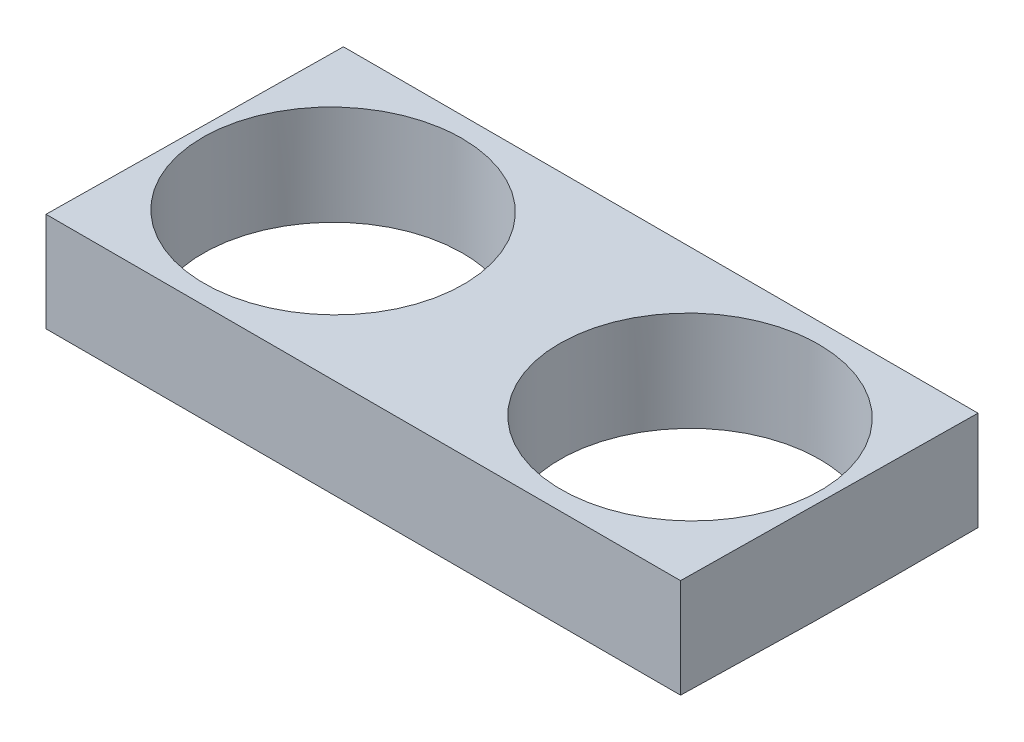
ISO-10303-21;
HEADER;
FILE_DESCRIPTION(('STEP AP214'),'2;1');
FILE_NAME('part.step','',(''),(''),'','','');
FILE_SCHEMA(('AUTOMOTIVE_DESIGN { 1 0 10303 214 1 1 1 1 }'));
ENDSEC;
DATA;
#1=APPLICATION_CONTEXT('core data for automotive mechanical design processes');
#2=APPLICATION_PROTOCOL_DEFINITION('international standard','automotive_design',2000,#1);
#3=PRODUCT_CONTEXT('',#1,'mechanical');
#4=PRODUCT('Part','Part','',(#3));
#5=PRODUCT_RELATED_PRODUCT_CATEGORY('part','',(#4));
#6=PRODUCT_DEFINITION_FORMATION('','',#4);
#7=PRODUCT_DEFINITION_CONTEXT('part definition',#1,'design');
#8=PRODUCT_DEFINITION('design','',#6,#7);
#9=PRODUCT_DEFINITION_SHAPE('','',#8);
#10=(LENGTH_UNIT() NAMED_UNIT(*) SI_UNIT(.MILLI.,.METRE.));
#11=(NAMED_UNIT(*) PLANE_ANGLE_UNIT() SI_UNIT($,.RADIAN.));
#12=(NAMED_UNIT(*) SI_UNIT($,.STERADIAN.) SOLID_ANGLE_UNIT());
#13=UNCERTAINTY_MEASURE_WITH_UNIT(LENGTH_MEASURE(1.E-05),#10,'distance_accuracy_value','');
#14=(GEOMETRIC_REPRESENTATION_CONTEXT(3) GLOBAL_UNCERTAINTY_ASSIGNED_CONTEXT((#13)) GLOBAL_UNIT_ASSIGNED_CONTEXT((#10,
#11,#12)) REPRESENTATION_CONTEXT('',''));
#15=CARTESIAN_POINT('',(0.,0.,0.));
#16=DIRECTION('',(0.,0.,1.));
#17=DIRECTION('',(1.,0.,0.));
#18=AXIS2_PLACEMENT_3D('',#15,#16,#17);
#19=CARTESIAN_POINT('',(-40.,-39.376697628539,0.));
#20=CARTESIAN_POINT('',(-40.,-37.8138326416831,-18.6089310298579));
#21=CARTESIAN_POINT('',(-40.,-41.4487875194083,-60.5220187074735));
#22=CARTESIAN_POINT('',(-40.,-41.8150395607881,-82.6293162514277));
#23=CARTESIAN_POINT('',(-40.,-29.981594576715,-94.4769548986795));
#24=CARTESIAN_POINT('',(-40.,-11.4071796829403,-72.3520517103376));
#25=CARTESIAN_POINT('',(-40.,50.0000000000028,-96.0000000000011));
#26=B_SPLINE_CURVE_WITH_KNOTS('',3,(#19,#20,#21,#22,#23,#24,#25),.UNSPECIFIED.,.F.,.F.,(4,1,1,1,
4),(0.,0.361871867439847,0.526261734758969,0.755385014590914,1.),.UNSPECIFIED.);
#27=DIRECTION('',(1.,0.,0.));
#28=VECTOR('',#27,1.);
#29=SURFACE_OF_LINEAR_EXTRUSION('',#26,#28);
#30=OFFSET_SURFACE('',#29,2.,.F.);
#31=CARTESIAN_POINT('',(-8.2,-43.4846999674052,-71.6589197518851));
#32=CARTESIAN_POINT('',(-8.2730311046294,-43.484700119259,-71.6589147411898));
#33=CARTESIAN_POINT('',(-8.34613827360442,-43.4847299976871,-71.652736707036));
#34=CARTESIAN_POINT('',(-8.45417117350626,-43.4848109393846,-71.6343574716182));
#35=CARTESIAN_POINT('',(-8.48993961729016,-43.4848439827656,-71.6267022929182));
#36=CARTESIAN_POINT('',(-8.5607403010147,-43.4849184029568,-71.6084015263036));
#37=CARTESIAN_POINT('',(-8.59577186269367,-43.484959787103,-71.5977533026889));
#38=CARTESIAN_POINT('',(-8.69924019137452,-43.4850898867195,-71.5614551785135));
#39=CARTESIAN_POINT('',(-8.76619225916654,-43.485184686194,-71.5314275694439));
#40=CARTESIAN_POINT('',(-8.89409773886185,-43.4853431040892,-71.4605441009441));
#41=CARTESIAN_POINT('',(-8.95505103639645,-43.4854067219156,-71.4196880351204));
#42=CARTESIAN_POINT('',(-9.04065984135483,-43.4854371714287,-71.35120631223));
#43=CARTESIAN_POINT('',(-9.06824224043239,-43.4854364697085,-71.3271611680723));
#44=CARTESIAN_POINT('',(-9.12125957292011,-43.4854065274751,-71.2768596953833));
#45=CARTESIAN_POINT('',(-9.14669654461631,-43.4853773143889,-71.2506055140542));
#46=CARTESIAN_POINT('',(-9.21956411274409,-43.485236688028,-71.1687421504002));
#47=CARTESIAN_POINT('',(-9.26357272305283,-43.4850723052621,-71.1100150266277));
#48=CARTESIAN_POINT('',(-9.34107848889395,-43.4845573771236,-70.9860410708964));
#49=CARTESIAN_POINT('',(-9.3745764461837,-43.484206845956,-70.9207947367269));
#50=CARTESIAN_POINT('',(-9.43015052031911,-43.4832915357773,-70.7855982753886));
#51=CARTESIAN_POINT('',(-9.45222666255389,-43.4827267572426,-70.715648158676));
#52=CARTESIAN_POINT('',(-9.48432261408263,-43.4813764152878,-70.573038247623));
#53=CARTESIAN_POINT('',(-9.49434228620548,-43.4805908493559,-70.5003784224629));
#54=CARTESIAN_POINT('',(-9.50204473417239,-43.4788158402181,-70.3544098638106));
#55=CARTESIAN_POINT('',(-9.49972751746942,-43.4778263971354,-70.2811011307104));
#56=CARTESIAN_POINT('',(-9.48282126129271,-43.4756827445833,-70.1359004551674));
#57=CARTESIAN_POINT('',(-9.46822977725025,-43.4745285023302,-70.0640087978716));
#58=CARTESIAN_POINT('',(-9.42718711418465,-43.4721136794608,-69.92369623756));
#59=CARTESIAN_POINT('',(-9.40073590063537,-43.4708530985349,-69.8552753446489));
#60=CARTESIAN_POINT('',(-9.33671590124714,-43.4682971320555,-69.7238274966024));
#61=CARTESIAN_POINT('',(-9.29914420095267,-43.4670017374591,-69.6608019610709));
#62=CARTESIAN_POINT('',(-9.21395143536276,-43.4644555358836,-69.5419534367519));
#63=CARTESIAN_POINT('',(-9.16633036871399,-43.4632047289105,-69.4861304489344));
#64=CARTESIAN_POINT('',(-9.06238783212648,-43.4608270812761,-69.3832707261848));
#65=CARTESIAN_POINT('',(-9.00606613741011,-43.4597002438187,-69.3362342183177));
#66=CARTESIAN_POINT('',(-8.88632101247231,-43.4576437747579,-69.252286322884));
#67=CARTESIAN_POINT('',(-8.82289759350578,-43.4567141428421,-69.2153749192715));
#68=CARTESIAN_POINT('',(-8.69077084176426,-43.4551135318066,-69.1527377427121));
#69=CARTESIAN_POINT('',(-8.62206921437095,-43.4544424695614,-69.1270083746023));
#70=CARTESIAN_POINT('',(-8.48131897712118,-43.4534030407574,-69.0874506505962));
#71=CARTESIAN_POINT('',(-8.40927037632351,-43.4530346733793,-69.0736222624912));
#72=CARTESIAN_POINT('',(-8.26390391551165,-43.4526252163381,-69.0582637352704));
#73=CARTESIAN_POINT('',(-8.19058660238719,-43.4525839890151,-69.0567284232448));
#74=CARTESIAN_POINT('',(-8.04473513685116,-43.4528311917071,-69.0659861530408));
#75=CARTESIAN_POINT('',(-7.97220098348782,-43.4531196213215,-69.076779179878));
#76=CARTESIAN_POINT('',(-7.829985634709,-43.454006895811,-69.1103837082416));
#77=CARTESIAN_POINT('',(-7.76030402362397,-43.4546056952842,-69.1331934519377));
#78=CARTESIAN_POINT('',(-7.62575908076851,-43.4560740026886,-69.1901814132578));
#79=CARTESIAN_POINT('',(-7.56089575447095,-43.4569435109272,-69.2243596437947));
#80=CARTESIAN_POINT('',(-7.43780985096077,-43.4588962306794,-69.3031236352898));
#81=CARTESIAN_POINT('',(-7.37958901038297,-43.4599794978777,-69.3477121086986));
#82=CARTESIAN_POINT('',(-7.27145730677073,-43.4622890291189,-69.4460256025569));
#83=CARTESIAN_POINT('',(-7.22154646868581,-43.4635152935911,-69.4997506504365));
#84=CARTESIAN_POINT('',(-7.13142901943667,-43.4660330629112,-69.6148382559401));
#85=CARTESIAN_POINT('',(-7.09122661164371,-43.4673245957262,-69.6762041043677));
#86=CARTESIAN_POINT('',(-7.02169366169863,-43.4698926538338,-69.8048139215318));
#87=CARTESIAN_POINT('',(-6.99236312495257,-43.471169179119,-69.8720578931911));
#88=CARTESIAN_POINT('',(-6.94540090688115,-43.4736331857149,-70.0105327164171));
#89=CARTESIAN_POINT('',(-6.9277718765237,-43.4748206467941,-70.0817644674516));
#90=CARTESIAN_POINT('',(-6.90472427739872,-43.4770438888363,-70.2261786268778));
#91=CARTESIAN_POINT('',(-6.89930572291848,-43.4780796696218,-70.2993610375517));
#92=CARTESIAN_POINT('',(-6.90083647466178,-43.4799548796775,-70.4455920549888));
#93=CARTESIAN_POINT('',(-6.90778421017439,-43.4807943338689,-70.5186406775654));
#94=CARTESIAN_POINT('',(-6.93384156757779,-43.4822542947002,-70.662528069064));
#95=CARTESIAN_POINT('',(-6.95295119452637,-43.482874801249,-70.733366837067));
#96=CARTESIAN_POINT('',(-7.00281210840516,-43.4838975386581,-70.8708440558217));
#97=CARTESIAN_POINT('',(-7.03356043688302,-43.4842998249249,-70.9374835689689));
#98=CARTESIAN_POINT('',(-7.08768986104761,-43.4847568796646,-71.0327875275548));
#99=CARTESIAN_POINT('',(-7.10707180401445,-43.4848848455595,-71.0637849151751));
#100=CARTESIAN_POINT('',(-7.14839374782826,-43.4850972177014,-71.1240700075654));
#101=CARTESIAN_POINT('',(-7.17033619126003,-43.4851815819313,-71.1533560391658));
#102=CARTESIAN_POINT('',(-7.23971960843986,-43.4853769123369,-71.2382309366724));
#103=CARTESIAN_POINT('',(-7.29077087730314,-43.4854305360042,-71.2909318249384));
#104=CARTESIAN_POINT('',(-7.40100404373378,-43.4854368439021,-71.387001365097));
#105=CARTESIAN_POINT('',(-7.46018578578999,-43.485389530063,-71.4303701954426));
#106=CARTESIAN_POINT('',(-7.5537610328151,-43.4852850140953,-71.4875116282677));
#107=CARTESIAN_POINT('',(-7.58578708116999,-43.4852445282061,-71.5052536770715));
#108=CARTESIAN_POINT('',(-7.65118713992218,-43.4851588232747,-71.5379630097838));
#109=CARTESIAN_POINT('',(-7.68455993580243,-43.4851136084409,-71.5529327286016));
#110=CARTESIAN_POINT('',(-7.7863493567919,-43.4849801675932,-71.5935097908752));
#111=CARTESIAN_POINT('',(-7.856541153469,-43.4848939894148,-71.6148485034743));
#112=CARTESIAN_POINT('',(-7.9726366687567,-43.484788052826,-71.6397019245009));
#113=CARTESIAN_POINT('',(-8.0177997616823,-43.484755507254,-71.6468984460223));
#114=CARTESIAN_POINT('',(-8.1086319751997,-43.4847114170324,-71.6565089275008));
#115=CARTESIAN_POINT('',(-8.15430109580753,-43.4846998723834,-71.6589228873065));
#116=CARTESIAN_POINT('',(-8.2,-43.4846999674052,-71.6589197518851));
#117=B_SPLINE_CURVE_WITH_KNOTS('',3,(#31,#32,#33,#34,#35,#36,#37,#38,#39,#40,#41,#42,#43,#44,
#45,#46,#47,#48,#49,#50,#51,#52,#53,#54,#55,#56,#57,#58,#59,#60,#61,#62,#63,#64,#65,#66,#67,#68,
#69,#70,#71,#72,#73,#74,#75,#76,#77,#78,#79,#80,#81,#82,#83,#84,#85,#86,#87,#88,#89,#90,#91,#92,
#93,#94,#95,#96,#97,#98,#99,#100,#101,#102,#103,#104,#105,#106,#107,#108,#109,#110,#111,#112,
#113,#114,#115,#116),.UNSPECIFIED.,.T.,.F.,(4,2,2,2,2,2,2,2,2,2,2,2,2,2,2,2,2,2,2,2,2,2,2,2,2,2,
2,2,2,2,2,2,2,2,2,2,2,2,2,2,2,2,4),(0.,0.218897761283568,0.328527371616642,0.438253826783454,
0.657281143813454,0.876312635867929,0.985973610236148,1.0955291980808,1.31455928998085,
1.53357267010231,1.75258556338514,1.97160094843849,2.19061620117997,2.40967508378666,
2.62873460412351,2.84785158645934,3.06696859830294,3.28609127190325,3.50521359824021,
3.7242654218192,3.9433166525554,4.16227570198346,4.38123448528035,4.60016124771919,
4.81908825882319,5.03807237644529,5.25705715152187,5.47613656914926,5.69521609571452,
5.91434523766549,6.13347463601606,6.35257620351538,6.57167786213309,6.79072386445707,
6.90028728184227,7.00995608489244,7.2289692103031,7.44797814724405,7.55769859620312,
7.66732221698715,7.88620809815425,8.02318244018313,8.16015678654703),.UNSPECIFIED.);
#118=CARTESIAN_POINT('',(-8.2,-43.4846999674052,-71.6589197518851));
#119=VERTEX_POINT('',#118);
#120=EDGE_CURVE('E166',#119,#119,#117,.T.);
#121=ORIENTED_EDGE('',*,*,#120,.T.);
#122=EDGE_LOOP('',(#121));
#123=FACE_BOUND('',#122,.T.);
#124=DIRECTION('',(1.,0.,0.));
#125=VECTOR('',#124,1.);
#126=CARTESIAN_POINT('',(0.,-43.4834502732561,-71.8589316958776));
#127=LINE('',#126,#125);
#128=CARTESIAN_POINT('',(-6.8,-43.4834502732561,-71.8589316958776));
#129=VERTEX_POINT('',#128);
#130=CARTESIAN_POINT('',(-13.2,-43.4834502732561,-71.8589316958776));
#131=VERTEX_POINT('',#130);
#132=EDGE_CURVE('E12',#129,#131,#127,.F.);
#133=ORIENTED_EDGE('',*,*,#132,.F.);
#134=CARTESIAN_POINT('',(-6.8,-43.4471154849081,-68.8589316958776));
#135=CARTESIAN_POINT('',(-6.8,-43.4518691412671,-69.0255607476172));
#136=CARTESIAN_POINT('',(-6.8,-43.4562562444957,-69.1922007044846));
#137=CARTESIAN_POINT('',(-6.8,-43.4642114739682,-69.5254888623006));
#138=CARTESIAN_POINT('',(-6.8,-43.4677796553685,-69.6921370619374));
#139=CARTESIAN_POINT('',(-6.8,-43.4740117074276,-70.0254438197788));
#140=CARTESIAN_POINT('',(-6.8,-43.4766756148282,-70.1921023772872));
#141=CARTESIAN_POINT('',(-6.8,-43.4810050897368,-70.5254341787751));
#142=CARTESIAN_POINT('',(-6.8,-43.4826706478442,-70.6921074228781));
#143=CARTESIAN_POINT('',(-6.8,-43.4849030154317,-71.0254668183174));
#144=CARTESIAN_POINT('',(-6.8,-43.4854697905965,-71.1921529698944));
#145=CARTESIAN_POINT('',(-6.8,-43.4853944042354,-71.5255380658306));
#146=CARTESIAN_POINT('',(-6.8,-43.4847521469752,-71.6922370101577));
#147=CARTESIAN_POINT('',(-6.8,-43.4834502732561,-71.8589316958777));
#148=B_SPLINE_CURVE_WITH_KNOTS('',3,(#134,#135,#136,#137,#138,#139,#140,#141,#142,#143,#144,
#145,#146,#147),.UNSPECIFIED.,.F.,.F.,(4,2,2,2,2,2,4),(0.,0.500090794916213,1.00014789763484,
1.50018467996219,2.00022617069861,2.50028327768226,3.00037998218205),.UNSPECIFIED.);
#149=CARTESIAN_POINT('',(-6.8,-43.4471154849081,-68.8589316958776));
#150=VERTEX_POINT('',#149);
#151=EDGE_CURVE('E123',#150,#129,#148,.T.);
#152=ORIENTED_EDGE('',*,*,#151,.F.);
#153=DIRECTION('',(1.,0.,0.));
#154=VECTOR('',#153,1.);
#155=CARTESIAN_POINT('',(0.,-43.4471154849081,-68.8589316958777));
#156=LINE('',#155,#154);
#157=CARTESIAN_POINT('',(-13.2,-43.4471154849081,-68.8589316958776));
#158=VERTEX_POINT('',#157);
#159=EDGE_CURVE('E163',#150,#158,#156,.F.);
#160=ORIENTED_EDGE('',*,*,#159,.T.);
#161=CARTESIAN_POINT('',(-13.2,-43.4471154849081,-68.8589316958776));
#162=CARTESIAN_POINT('',(-13.2,-43.4518691412671,-69.0255607476172));
#163=CARTESIAN_POINT('',(-13.2,-43.4562562444957,-69.1922007044846));
#164=CARTESIAN_POINT('',(-13.2,-43.4642114739682,-69.5254888623006));
#165=CARTESIAN_POINT('',(-13.2,-43.4677796553685,-69.6921370619374));
#166=CARTESIAN_POINT('',(-13.2,-43.4740117074276,-70.0254438197788));
#167=CARTESIAN_POINT('',(-13.2,-43.4766756148282,-70.1921023772872));
#168=CARTESIAN_POINT('',(-13.2,-43.4810050897368,-70.5254341787751));
#169=CARTESIAN_POINT('',(-13.2,-43.4826706478442,-70.6921074228781));
#170=CARTESIAN_POINT('',(-13.2,-43.4849030154317,-71.0254668183174));
#171=CARTESIAN_POINT('',(-13.2,-43.4854697905965,-71.1921529698944));
#172=CARTESIAN_POINT('',(-13.2,-43.4853944042354,-71.5255380658306));
#173=CARTESIAN_POINT('',(-13.2,-43.4847521469752,-71.6922370101577));
#174=CARTESIAN_POINT('',(-13.2,-43.4834502732561,-71.8589316958777));
#175=B_SPLINE_CURVE_WITH_KNOTS('',3,(#161,#162,#163,#164,#165,#166,#167,#168,#169,#170,#171,
#172,#173,#174),.UNSPECIFIED.,.F.,.F.,(4,2,2,2,2,2,4),(0.,0.500090794916213,1.00014789763484,
1.50018467996219,2.00022617069861,2.50028327768226,3.00037998218205),.UNSPECIFIED.);
#176=EDGE_CURVE('E72',#158,#131,#175,.T.);
#177=ORIENTED_EDGE('',*,*,#176,.T.);
#178=EDGE_LOOP('',(#133,#152,#160,#177));
#179=FACE_BOUND('',#178,.T.);
#180=CARTESIAN_POINT('',(-11.8,-43.4846999674052,-71.6589197518851));
#181=CARTESIAN_POINT('',(-11.8730311046294,-43.484700119259,-71.6589147411898));
#182=CARTESIAN_POINT('',(-11.9461382736044,-43.4847299976871,-71.652736707036));
#183=CARTESIAN_POINT('',(-12.0541711735063,-43.4848109393846,-71.6343574716182));
#184=CARTESIAN_POINT('',(-12.0899396172902,-43.4848439827656,-71.6267022929182));
#185=CARTESIAN_POINT('',(-12.1607403010147,-43.4849184029568,-71.6084015263036));
#186=CARTESIAN_POINT('',(-12.1957718626937,-43.484959787103,-71.5977533026889));
#187=CARTESIAN_POINT('',(-12.2992401913745,-43.4850898867196,-71.5614551785135));
#188=CARTESIAN_POINT('',(-12.3661922591665,-43.485184686194,-71.5314275694439));
#189=CARTESIAN_POINT('',(-12.4940977388619,-43.4853431040892,-71.4605441009441));
#190=CARTESIAN_POINT('',(-12.5550510363965,-43.4854067219156,-71.4196880351204));
#191=CARTESIAN_POINT('',(-12.6406598413548,-43.4854371714287,-71.35120631223));
#192=CARTESIAN_POINT('',(-12.6682422404324,-43.4854364697085,-71.3271611680723));
#193=CARTESIAN_POINT('',(-12.7212595729201,-43.4854065274751,-71.2768596953833));
#194=CARTESIAN_POINT('',(-12.7466965446163,-43.4853773143889,-71.2506055140542));
#195=CARTESIAN_POINT('',(-12.8195641127441,-43.4852366880279,-71.1687421504002));
#196=CARTESIAN_POINT('',(-12.8635727230528,-43.4850723052621,-71.1100150266277));
#197=CARTESIAN_POINT('',(-12.941078488894,-43.4845573771236,-70.9860410708964));
#198=CARTESIAN_POINT('',(-12.9745764461837,-43.484206845956,-70.9207947367269));
#199=CARTESIAN_POINT('',(-13.0301505203191,-43.4832915357773,-70.7855982753886));
#200=CARTESIAN_POINT('',(-13.0522266625539,-43.4827267572426,-70.715648158676));
#201=CARTESIAN_POINT('',(-13.0843226140826,-43.4813764152878,-70.573038247623));
#202=CARTESIAN_POINT('',(-13.0943422862055,-43.4805908493559,-70.5003784224629));
#203=CARTESIAN_POINT('',(-13.1020447341724,-43.4788158402181,-70.3544098638106));
#204=CARTESIAN_POINT('',(-13.0997275174694,-43.4778263971354,-70.2811011307104));
#205=CARTESIAN_POINT('',(-13.0828212612927,-43.4756827445833,-70.1359004551674));
#206=CARTESIAN_POINT('',(-13.0682297772503,-43.4745285023302,-70.0640087978716));
#207=CARTESIAN_POINT('',(-13.0271871141847,-43.4721136794608,-69.92369623756));
#208=CARTESIAN_POINT('',(-13.0007359006354,-43.4708530985349,-69.8552753446489));
#209=CARTESIAN_POINT('',(-12.9367159012472,-43.4682971320555,-69.7238274966024));
#210=CARTESIAN_POINT('',(-12.8991442009527,-43.4670017374591,-69.6608019610709));
#211=CARTESIAN_POINT('',(-12.8139514353628,-43.4644555358836,-69.5419534367519));
#212=CARTESIAN_POINT('',(-12.766330368714,-43.4632047289105,-69.4861304489344));
#213=CARTESIAN_POINT('',(-12.6623878321265,-43.4608270812761,-69.3832707261848));
#214=CARTESIAN_POINT('',(-12.6060661374101,-43.4597002438187,-69.3362342183177));
#215=CARTESIAN_POINT('',(-12.4863210124723,-43.4576437747579,-69.252286322884));
#216=CARTESIAN_POINT('',(-12.4228975935058,-43.4567141428421,-69.2153749192715));
#217=CARTESIAN_POINT('',(-12.2907708417643,-43.4551135318066,-69.1527377427121));
#218=CARTESIAN_POINT('',(-12.222069214371,-43.4544424695614,-69.1270083746023));
#219=CARTESIAN_POINT('',(-12.0813189771212,-43.4534030407574,-69.0874506505962));
#220=CARTESIAN_POINT('',(-12.0092703763235,-43.4530346733793,-69.0736222624912));
#221=CARTESIAN_POINT('',(-11.8639039155117,-43.4526252163381,-69.0582637352704));
#222=CARTESIAN_POINT('',(-11.7905866023872,-43.4525839890151,-69.0567284232448));
#223=CARTESIAN_POINT('',(-11.6447351368512,-43.4528311917071,-69.0659861530408));
#224=CARTESIAN_POINT('',(-11.5722009834878,-43.4531196213215,-69.076779179878));
#225=CARTESIAN_POINT('',(-11.429985634709,-43.454006895811,-69.1103837082416));
#226=CARTESIAN_POINT('',(-11.360304023624,-43.4546056952842,-69.1331934519376));
#227=CARTESIAN_POINT('',(-11.2257590807685,-43.4560740026886,-69.1901814132578));
#228=CARTESIAN_POINT('',(-11.160895754471,-43.4569435109272,-69.2243596437947));
#229=CARTESIAN_POINT('',(-11.0378098509608,-43.4588962306794,-69.3031236352898));
#230=CARTESIAN_POINT('',(-10.979589010383,-43.4599794978777,-69.3477121086986));
#231=CARTESIAN_POINT('',(-10.8714573067707,-43.4622890291189,-69.4460256025569));
#232=CARTESIAN_POINT('',(-10.8215464686858,-43.4635152935911,-69.4997506504365));
#233=CARTESIAN_POINT('',(-10.7314290194367,-43.4660330629112,-69.6148382559401));
#234=CARTESIAN_POINT('',(-10.6912266116437,-43.4673245957262,-69.6762041043677));
#235=CARTESIAN_POINT('',(-10.6216936616986,-43.4698926538338,-69.8048139215318));
#236=CARTESIAN_POINT('',(-10.5923631249526,-43.471169179119,-69.8720578931911));
#237=CARTESIAN_POINT('',(-10.5454009068812,-43.4736331857149,-70.0105327164171));
#238=CARTESIAN_POINT('',(-10.5277718765237,-43.4748206467941,-70.0817644674516));
#239=CARTESIAN_POINT('',(-10.5047242773987,-43.4770438888363,-70.2261786268778));
#240=CARTESIAN_POINT('',(-10.4993057229185,-43.4780796696218,-70.2993610375517));
#241=CARTESIAN_POINT('',(-10.5008364746618,-43.4799548796775,-70.4455920549888));
#242=CARTESIAN_POINT('',(-10.5077842101744,-43.4807943338689,-70.5186406775654));
#243=CARTESIAN_POINT('',(-10.5338415675778,-43.4822542947002,-70.662528069064));
#244=CARTESIAN_POINT('',(-10.5529511945264,-43.482874801249,-70.733366837067));
#245=CARTESIAN_POINT('',(-10.6028121084052,-43.4838975386581,-70.8708440558218));
#246=CARTESIAN_POINT('',(-10.633560436883,-43.4842998249249,-70.9374835689689));
#247=CARTESIAN_POINT('',(-10.6876898610476,-43.4847568796646,-71.0327875275548));
#248=CARTESIAN_POINT('',(-10.7070718040145,-43.4848848455595,-71.0637849151751));
#249=CARTESIAN_POINT('',(-10.7483937478283,-43.4850972177014,-71.1240700075654));
#250=CARTESIAN_POINT('',(-10.77033619126,-43.4851815819313,-71.1533560391658));
#251=CARTESIAN_POINT('',(-10.8397196084399,-43.4853769123369,-71.2382309366724));
#252=CARTESIAN_POINT('',(-10.8907708773031,-43.4854305360042,-71.2909318249384));
#253=CARTESIAN_POINT('',(-11.0010040437338,-43.4854368439021,-71.387001365097));
#254=CARTESIAN_POINT('',(-11.06018578579,-43.485389530063,-71.4303701954426));
#255=CARTESIAN_POINT('',(-11.1537610328151,-43.4852850140953,-71.4875116282677));
#256=CARTESIAN_POINT('',(-11.18578708117,-43.4852445282061,-71.5052536770715));
#257=CARTESIAN_POINT('',(-11.2511871399222,-43.4851588232747,-71.5379630097838));
#258=CARTESIAN_POINT('',(-11.2845599358024,-43.4851136084409,-71.5529327286016));
#259=CARTESIAN_POINT('',(-11.3863493567919,-43.4849801675932,-71.5935097908752));
#260=CARTESIAN_POINT('',(-11.456541153469,-43.4848939894148,-71.6148485034743));
#261=CARTESIAN_POINT('',(-11.5726366687567,-43.484788052826,-71.6397019245009));
#262=CARTESIAN_POINT('',(-11.6177997616823,-43.484755507254,-71.6468984460223));
#263=CARTESIAN_POINT('',(-11.7086319751997,-43.4847114170324,-71.6565089275008));
#264=CARTESIAN_POINT('',(-11.7543010958075,-43.4846998723834,-71.6589228873065));
#265=CARTESIAN_POINT('',(-11.8,-43.4846999674052,-71.6589197518851));
#266=B_SPLINE_CURVE_WITH_KNOTS('',3,(#180,#181,#182,#183,#184,#185,#186,#187,#188,#189,#190,
#191,#192,#193,#194,#195,#196,#197,#198,#199,#200,#201,#202,#203,#204,#205,#206,#207,#208,#209,
#210,#211,#212,#213,#214,#215,#216,#217,#218,#219,#220,#221,#222,#223,#224,#225,#226,#227,#228,
#229,#230,#231,#232,#233,#234,#235,#236,#237,#238,#239,#240,#241,#242,#243,#244,#245,#246,#247,
#248,#249,#250,#251,#252,#253,#254,#255,#256,#257,#258,#259,#260,#261,#262,#263,#264,#265),
.UNSPECIFIED.,.T.,.F.,(4,2,2,2,2,2,2,2,2,2,2,2,2,2,2,2,2,2,2,2,2,2,2,2,2,2,2,2,2,2,2,2,2,2,2,2,
2,2,2,2,2,2,4),(0.,0.218897761283568,0.328527371616638,0.438253826783449,0.657281143813451,
0.876312635867932,0.985973610236152,1.0955291980808,1.31455928998084,1.5335726701023,
1.75258556338514,1.9716009484385,2.19061620117997,2.40967508378666,2.62873460412351,
2.84785158645934,3.06696859830293,3.28609127190324,3.50521359824021,3.72426542181919,
3.9433166525554,4.16227570198346,4.38123448528035,4.60016124771919,4.81908825882319,
5.03807237644529,5.25705715152186,5.47613656914925,5.69521609571453,5.9143452376655,
6.13347463601607,6.35257620351539,6.57167786213313,6.7907238644571,6.90028728184229,
7.00995608489245,7.22896921030311,7.44797814724406,7.55769859620313,7.66732221698716,
7.88620809815427,8.02318244018314,8.16015678654705),.UNSPECIFIED.);
#267=CARTESIAN_POINT('',(-11.8,-43.4846999674052,-71.6589197518851));
#268=VERTEX_POINT('',#267);
#269=EDGE_CURVE('E174',#268,#268,#266,.T.);
#270=ORIENTED_EDGE('',*,*,#269,.T.);
#271=EDGE_LOOP('',(#270));
#272=FACE_BOUND('',#271,.T.);
#273=ADVANCED_FACE('F63',(#123,#179,#272),#30,.T.);
#274=CARTESIAN_POINT('',(0.,-58.3249066608493,-71.8589316958776));
#275=DIRECTION('',(0.,0.,1.));
#276=DIRECTION('',(1.,0.,0.));
#277=AXIS2_PLACEMENT_3D('',#274,#275,#276);
#278=PLANE('',#277);
#279=DIRECTION('',(0.,1.,0.));
#280=VECTOR('',#279,1.);
#281=CARTESIAN_POINT('',(-13.2,-58.3249066608493,-71.8589316958776));
#282=LINE('',#281,#280);
#283=CARTESIAN_POINT('',(-13.2,-42.4834187069506,-71.8589316958776));
#284=VERTEX_POINT('',#283);
#285=EDGE_CURVE('E121',#131,#284,#282,.T.);
#286=ORIENTED_EDGE('',*,*,#285,.T.);
#287=DIRECTION('',(1.,0.,0.));
#288=VECTOR('',#287,1.);
#289=CARTESIAN_POINT('',(-13.2,-42.4834187069506,-71.8589316958776));
#290=LINE('',#289,#288);
#291=CARTESIAN_POINT('',(-6.8,-42.4834187069506,-71.8589316958776));
#292=VERTEX_POINT('',#291);
#293=EDGE_CURVE('E106',#284,#292,#290,.T.);
#294=ORIENTED_EDGE('',*,*,#293,.T.);
#295=DIRECTION('',(0.,1.,0.));
#296=VECTOR('',#295,1.);
#297=CARTESIAN_POINT('',(-6.8,-58.3249066608493,-71.8589316958776));
#298=LINE('',#297,#296);
#299=EDGE_CURVE('E125',#129,#292,#298,.T.);
#300=ORIENTED_EDGE('',*,*,#299,.F.);
#301=ORIENTED_EDGE('',*,*,#132,.T.);
#302=EDGE_LOOP('',(#286,#294,#300,#301));
#303=FACE_BOUND('',#302,.T.);
#304=ADVANCED_FACE('F145',(#303),#278,.F.);
#305=CARTESIAN_POINT('',(-13.2,-58.3249066608493,0.));
#306=DIRECTION('',(-1.,0.,0.));
#307=DIRECTION('',(0.,0.,1.));
#308=AXIS2_PLACEMENT_3D('',#305,#306,#307);
#309=PLANE('',#308);
#310=DIRECTION('',(0.,-0.0123658441326643,-0.99992354002638));
#311=VECTOR('',#310,1.);
#312=CARTESIAN_POINT('',(-13.2,-42.4834187069506,-71.8589316958776));
#313=LINE('',#312,#311);
#314=CARTESIAN_POINT('',(-13.2,-42.4463183378594,-68.8589316958776));
#315=VERTEX_POINT('',#314);
#316=EDGE_CURVE('E103',#315,#284,#313,.T.);
#317=ORIENTED_EDGE('',*,*,#316,.T.);
#318=ORIENTED_EDGE('',*,*,#285,.F.);
#319=ORIENTED_EDGE('',*,*,#176,.F.);
#320=DIRECTION('',(0.,1.,0.));
#321=VECTOR('',#320,1.);
#322=CARTESIAN_POINT('',(-13.2,-58.3249066608493,-68.8589316958776));
#323=LINE('',#322,#321);
#324=EDGE_CURVE('E116',#158,#315,#323,.T.);
#325=ORIENTED_EDGE('',*,*,#324,.T.);
#326=EDGE_LOOP('',(#317,#318,#319,#325));
#327=FACE_BOUND('',#326,.T.);
#328=ADVANCED_FACE('F119',(#327),#309,.T.);
#329=CARTESIAN_POINT('',(0.,-58.3249066608493,-68.8589316958776));
#330=DIRECTION('',(0.,0.,1.));
#331=DIRECTION('',(1.,0.,0.));
#332=AXIS2_PLACEMENT_3D('',#329,#330,#331);
#333=PLANE('',#332);
#334=DIRECTION('',(1.,0.,0.));
#335=VECTOR('',#334,1.);
#336=CARTESIAN_POINT('',(-13.2,-42.4463183378594,-68.8589316958776));
#337=LINE('',#336,#335);
#338=CARTESIAN_POINT('',(-6.8,-42.4463183378594,-68.8589316958776));
#339=VERTEX_POINT('',#338);
#340=EDGE_CURVE('E80',#315,#339,#337,.T.);
#341=ORIENTED_EDGE('',*,*,#340,.F.);
#342=ORIENTED_EDGE('',*,*,#324,.F.);
#343=ORIENTED_EDGE('',*,*,#159,.F.);
#344=DIRECTION('',(0.,1.,0.));
#345=VECTOR('',#344,1.);
#346=CARTESIAN_POINT('',(-6.8,-58.3249066608493,-68.8589316958776));
#347=LINE('',#346,#345);
#348=EDGE_CURVE('E87',#150,#339,#347,.T.);
#349=ORIENTED_EDGE('',*,*,#348,.T.);
#350=EDGE_LOOP('',(#341,#342,#343,#349));
#351=FACE_BOUND('',#350,.T.);
#352=ADVANCED_FACE('F115',(#351),#333,.T.);
#353=CARTESIAN_POINT('',(-6.8,-58.3249066608493,0.));
#354=DIRECTION('',(-1.,0.,0.));
#355=DIRECTION('',(0.,0.,1.));
#356=AXIS2_PLACEMENT_3D('',#353,#354,#355);
#357=PLANE('',#356);
#358=ORIENTED_EDGE('',*,*,#299,.T.);
#359=DIRECTION('',(0.,-0.0123658441326643,-0.99992354002638));
#360=VECTOR('',#359,1.);
#361=CARTESIAN_POINT('',(-6.8,-42.4834187069506,-71.8589316958776));
#362=LINE('',#361,#360);
#363=EDGE_CURVE('E111',#339,#292,#362,.T.);
#364=ORIENTED_EDGE('',*,*,#363,.F.);
#365=ORIENTED_EDGE('',*,*,#348,.F.);
#366=ORIENTED_EDGE('',*,*,#151,.T.);
#367=EDGE_LOOP('',(#358,#364,#365,#366));
#368=FACE_BOUND('',#367,.T.);
#369=ADVANCED_FACE('F148',(#368),#357,.F.);
#370=CARTESIAN_POINT('',(-13.2,-42.4834187069506,-71.8589316958776));
#371=DIRECTION('',(0.,-0.99992354002638,0.0123658441326643));
#372=DIRECTION('',(0.,-0.0123658441326643,-0.99992354002638));
#373=AXIS2_PLACEMENT_3D('',#370,#371,#372);
#374=PLANE('',#373);
#375=CARTESIAN_POINT('',(-11.8,-42.46481075592,-70.3542605980089));
#376=DIRECTION('',(0.,-0.99992354002638,0.0123658441326643));
#377=DIRECTION('',(0.,-0.0123658441326643,-0.99992354002638));
#378=AXIS2_PLACEMENT_3D('',#375,#376,#377);
#379=ELLIPSE('',#378,1.30018613472626,1.3);
#380=CARTESIAN_POINT('',(-11.8,-42.4808886550055,-71.6543473205376));
#381=VERTEX_POINT('',#380);
#382=EDGE_CURVE('E67',#381,#381,#379,.F.);
#383=ORIENTED_EDGE('',*,*,#382,.F.);
#384=EDGE_LOOP('',(#383));
#385=FACE_BOUND('',#384,.T.);
#386=CARTESIAN_POINT('',(-8.2,-42.46481075592,-70.3542605980089));
#387=DIRECTION('',(0.,-0.99992354002638,0.0123658441326643));
#388=DIRECTION('',(0.,-0.0123658441326643,-0.99992354002638));
#389=AXIS2_PLACEMENT_3D('',#386,#387,#388);
#390=ELLIPSE('',#389,1.30018613472626,1.3);
#391=CARTESIAN_POINT('',(-8.2,-42.4808886550055,-71.6543473205376));
#392=VERTEX_POINT('',#391);
#393=EDGE_CURVE('E164',#392,#392,#390,.F.);
#394=ORIENTED_EDGE('',*,*,#393,.F.);
#395=EDGE_LOOP('',(#394));
#396=FACE_BOUND('',#395,.T.);
#397=ORIENTED_EDGE('',*,*,#363,.T.);
#398=ORIENTED_EDGE('',*,*,#293,.F.);
#399=ORIENTED_EDGE('',*,*,#316,.F.);
#400=ORIENTED_EDGE('',*,*,#340,.T.);
#401=EDGE_LOOP('',(#397,#398,#399,#400));
#402=FACE_BOUND('',#401,.T.);
#403=ADVANCED_FACE('F104',(#385,#396,#402),#374,.F.);
#404=CARTESIAN_POINT('',(-8.2,-42.4395075342219,-70.3541453400489));
#405=DIRECTION('',(0.,-0.999989625827577,-0.00455502329556929));
#406=DIRECTION('',(0.,0.00455502329556929,-0.999989625827577));
#407=AXIS2_PLACEMENT_3D('',#404,#405,#406);
#408=CYLINDRICAL_SURFACE('',#407,1.3);
#409=ORIENTED_EDGE('',*,*,#120,.F.);
#410=EDGE_LOOP('',(#409));
#411=FACE_BOUND('',#410,.T.);
#412=ORIENTED_EDGE('',*,*,#393,.T.);
#413=EDGE_LOOP('',(#412));
#414=FACE_BOUND('',#413,.T.);
#415=ADVANCED_FACE('F183',(#411,#414),#408,.F.);
#416=CARTESIAN_POINT('',(-11.8,-42.4395075342219,-70.3541453400489));
#417=DIRECTION('',(0.,-0.999989625827577,-0.00455502329556929));
#418=DIRECTION('',(0.,0.00455502329556929,-0.999989625827577));
#419=AXIS2_PLACEMENT_3D('',#416,#417,#418);
#420=CYLINDRICAL_SURFACE('',#419,1.3);
#421=ORIENTED_EDGE('',*,*,#269,.F.);
#422=EDGE_LOOP('',(#421));
#423=FACE_BOUND('',#422,.T.);
#424=ORIENTED_EDGE('',*,*,#382,.T.);
#425=EDGE_LOOP('',(#424));
#426=FACE_BOUND('',#425,.T.);
#427=ADVANCED_FACE('F186',(#423,#426),#420,.F.);
#428=CLOSED_SHELL('',(#273,#304,#328,#352,#369,#403,#415,#427));
#429=MANIFOLD_SOLID_BREP('B2',#428);
#430=ADVANCED_BREP_SHAPE_REPRESENTATION('',(#18,#429),#14);
#431=SHAPE_DEFINITION_REPRESENTATION(#9,#430);
ENDSEC;
END-ISO-10303-21;
